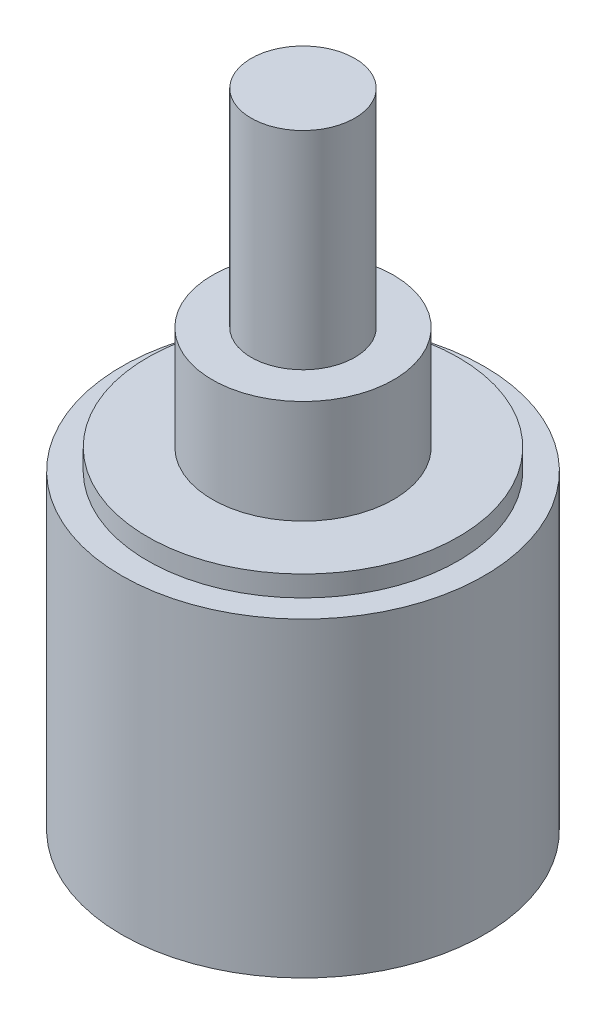
ISO-10303-21;
HEADER;
FILE_DESCRIPTION(('STEP AP214'),'2;1');
FILE_NAME('part.step','',(''),(''),'','','');
FILE_SCHEMA(('AUTOMOTIVE_DESIGN { 1 0 10303 214 1 1 1 1 }'));
ENDSEC;
DATA;
#1=APPLICATION_CONTEXT('core data for automotive mechanical design processes');
#2=APPLICATION_PROTOCOL_DEFINITION('international standard','automotive_design',2000,#1);
#3=PRODUCT_CONTEXT('',#1,'mechanical');
#4=PRODUCT('Part','Part','',(#3));
#5=PRODUCT_RELATED_PRODUCT_CATEGORY('part','',(#4));
#6=PRODUCT_DEFINITION_FORMATION('','',#4);
#7=PRODUCT_DEFINITION_CONTEXT('part definition',#1,'design');
#8=PRODUCT_DEFINITION('design','',#6,#7);
#9=PRODUCT_DEFINITION_SHAPE('','',#8);
#10=(LENGTH_UNIT() NAMED_UNIT(*) SI_UNIT(.MILLI.,.METRE.));
#11=(NAMED_UNIT(*) PLANE_ANGLE_UNIT() SI_UNIT($,.RADIAN.));
#12=(NAMED_UNIT(*) SI_UNIT($,.STERADIAN.) SOLID_ANGLE_UNIT());
#13=UNCERTAINTY_MEASURE_WITH_UNIT(LENGTH_MEASURE(1.E-05),#10,'distance_accuracy_value','');
#14=(GEOMETRIC_REPRESENTATION_CONTEXT(3) GLOBAL_UNCERTAINTY_ASSIGNED_CONTEXT((#13)) GLOBAL_UNIT_ASSIGNED_CONTEXT((#10,
#11,#12)) REPRESENTATION_CONTEXT('',''));
#15=CARTESIAN_POINT('',(0.,0.,0.));
#16=DIRECTION('',(0.,0.,1.));
#17=DIRECTION('',(1.,0.,0.));
#18=AXIS2_PLACEMENT_3D('',#15,#16,#17);
#19=CARTESIAN_POINT('',(0.,0.,0.));
#20=DIRECTION('',(0.,-1.,0.));
#21=DIRECTION('',(0.,0.,-1.));
#22=AXIS2_PLACEMENT_3D('',#19,#20,#21);
#23=CYLINDRICAL_SURFACE('',#22,11.1125);
#24=CARTESIAN_POINT('',(0.,19.05,0.));
#25=DIRECTION('',(0.,-1.,0.));
#26=DIRECTION('',(0.,0.,-1.));
#27=AXIS2_PLACEMENT_3D('',#24,#25,#26);
#28=CIRCLE('',#27,11.1125);
#29=CARTESIAN_POINT('',(0.,19.05,-11.1125));
#30=VERTEX_POINT('',#29);
#31=EDGE_CURVE('E10',#30,#30,#28,.T.);
#32=ORIENTED_EDGE('',*,*,#31,.T.);
#33=EDGE_LOOP('',(#32));
#34=FACE_BOUND('',#33,.T.);
#35=CARTESIAN_POINT('',(0.,0.,0.));
#36=DIRECTION('',(0.,-1.,0.));
#37=DIRECTION('',(0.,0.,-1.));
#38=AXIS2_PLACEMENT_3D('',#35,#36,#37);
#39=CIRCLE('',#38,11.1125);
#40=CARTESIAN_POINT('',(0.,0.,-11.1125));
#41=VERTEX_POINT('',#40);
#42=EDGE_CURVE('E61',#41,#41,#39,.T.);
#43=ORIENTED_EDGE('',*,*,#42,.F.);
#44=EDGE_LOOP('',(#43));
#45=FACE_BOUND('',#44,.T.);
#46=ADVANCED_FACE('F33',(#34,#45),#23,.T.);
#47=CARTESIAN_POINT('',(11.1125,19.05,0.));
#48=DIRECTION('',(0.,1.,0.));
#49=DIRECTION('',(0.,0.,1.));
#50=AXIS2_PLACEMENT_3D('',#47,#48,#49);
#51=PLANE('',#50);
#52=CARTESIAN_POINT('',(0.,19.05,0.));
#53=DIRECTION('',(0.,-1.,0.));
#54=DIRECTION('',(0.,0.,-1.));
#55=AXIS2_PLACEMENT_3D('',#52,#53,#54);
#56=CIRCLE('',#55,9.525);
#57=CARTESIAN_POINT('',(0.,19.05,-9.525));
#58=VERTEX_POINT('',#57);
#59=EDGE_CURVE('E39',#58,#58,#56,.T.);
#60=ORIENTED_EDGE('',*,*,#59,.T.);
#61=EDGE_LOOP('',(#60));
#62=FACE_BOUND('',#61,.T.);
#63=ORIENTED_EDGE('',*,*,#31,.F.);
#64=EDGE_LOOP('',(#63));
#65=FACE_BOUND('',#64,.T.);
#66=ADVANCED_FACE('F68',(#62,#65),#51,.T.);
#67=CARTESIAN_POINT('',(0.,0.,0.));
#68=DIRECTION('',(0.,-1.,0.));
#69=DIRECTION('',(0.,0.,-1.));
#70=AXIS2_PLACEMENT_3D('',#67,#68,#69);
#71=CYLINDRICAL_SURFACE('',#70,9.525);
#72=CARTESIAN_POINT('',(0.,20.32,0.));
#73=DIRECTION('',(0.,-1.,0.));
#74=DIRECTION('',(0.,0.,-1.));
#75=AXIS2_PLACEMENT_3D('',#72,#73,#74);
#76=CIRCLE('',#75,9.525);
#77=CARTESIAN_POINT('',(0.,20.32,-9.525));
#78=VERTEX_POINT('',#77);
#79=EDGE_CURVE('E43',#78,#78,#76,.T.);
#80=ORIENTED_EDGE('',*,*,#79,.T.);
#81=EDGE_LOOP('',(#80));
#82=FACE_BOUND('',#81,.T.);
#83=ORIENTED_EDGE('',*,*,#59,.F.);
#84=EDGE_LOOP('',(#83));
#85=FACE_BOUND('',#84,.T.);
#86=ADVANCED_FACE('F72',(#82,#85),#71,.T.);
#87=CARTESIAN_POINT('',(9.525,20.32,0.));
#88=DIRECTION('',(0.,1.,0.));
#89=DIRECTION('',(0.,0.,1.));
#90=AXIS2_PLACEMENT_3D('',#87,#88,#89);
#91=PLANE('',#90);
#92=CARTESIAN_POINT('',(0.,20.32,0.));
#93=DIRECTION('',(0.,-1.,0.));
#94=DIRECTION('',(0.,0.,-1.));
#95=AXIS2_PLACEMENT_3D('',#92,#93,#94);
#96=CIRCLE('',#95,5.55625);
#97=CARTESIAN_POINT('',(0.,20.32,-5.55625));
#98=VERTEX_POINT('',#97);
#99=EDGE_CURVE('E47',#98,#98,#96,.T.);
#100=ORIENTED_EDGE('',*,*,#99,.T.);
#101=EDGE_LOOP('',(#100));
#102=FACE_BOUND('',#101,.T.);
#103=ORIENTED_EDGE('',*,*,#79,.F.);
#104=EDGE_LOOP('',(#103));
#105=FACE_BOUND('',#104,.T.);
#106=ADVANCED_FACE('F76',(#102,#105),#91,.T.);
#107=CARTESIAN_POINT('',(0.,0.,0.));
#108=DIRECTION('',(0.,-1.,0.));
#109=DIRECTION('',(0.,0.,-1.));
#110=AXIS2_PLACEMENT_3D('',#107,#108,#109);
#111=CYLINDRICAL_SURFACE('',#110,5.55625);
#112=CARTESIAN_POINT('',(0.,26.67,0.));
#113=DIRECTION('',(0.,-1.,0.));
#114=DIRECTION('',(0.,0.,-1.));
#115=AXIS2_PLACEMENT_3D('',#112,#113,#114);
#116=CIRCLE('',#115,5.55625);
#117=CARTESIAN_POINT('',(0.,26.67,-5.55625));
#118=VERTEX_POINT('',#117);
#119=EDGE_CURVE('E52',#118,#118,#116,.T.);
#120=ORIENTED_EDGE('',*,*,#119,.T.);
#121=EDGE_LOOP('',(#120));
#122=FACE_BOUND('',#121,.T.);
#123=ORIENTED_EDGE('',*,*,#99,.F.);
#124=EDGE_LOOP('',(#123));
#125=FACE_BOUND('',#124,.T.);
#126=ADVANCED_FACE('F83',(#122,#125),#111,.T.);
#127=CARTESIAN_POINT('',(5.55625,26.67,0.));
#128=DIRECTION('',(0.,1.,0.));
#129=DIRECTION('',(0.,0.,1.));
#130=AXIS2_PLACEMENT_3D('',#127,#128,#129);
#131=PLANE('',#130);
#132=CARTESIAN_POINT('',(0.,26.67,0.));
#133=DIRECTION('',(0.,-1.,0.));
#134=DIRECTION('',(0.,0.,-1.));
#135=AXIS2_PLACEMENT_3D('',#132,#133,#134);
#136=CIRCLE('',#135,3.175);
#137=CARTESIAN_POINT('',(0.,26.67,-3.175));
#138=VERTEX_POINT('',#137);
#139=EDGE_CURVE('E55',#138,#138,#136,.T.);
#140=ORIENTED_EDGE('',*,*,#139,.T.);
#141=EDGE_LOOP('',(#140));
#142=FACE_BOUND('',#141,.T.);
#143=ORIENTED_EDGE('',*,*,#119,.F.);
#144=EDGE_LOOP('',(#143));
#145=FACE_BOUND('',#144,.T.);
#146=ADVANCED_FACE('F87',(#142,#145),#131,.T.);
#147=CARTESIAN_POINT('',(0.,0.,0.));
#148=DIRECTION('',(0.,-1.,0.));
#149=DIRECTION('',(0.,0.,-1.));
#150=AXIS2_PLACEMENT_3D('',#147,#148,#149);
#151=CYLINDRICAL_SURFACE('',#150,3.175);
#152=CARTESIAN_POINT('',(0.,39.37,0.));
#153=DIRECTION('',(0.,-1.,0.));
#154=DIRECTION('',(0.,0.,-1.));
#155=AXIS2_PLACEMENT_3D('',#152,#153,#154);
#156=CIRCLE('',#155,3.175);
#157=CARTESIAN_POINT('',(0.,39.37,-3.175));
#158=VERTEX_POINT('',#157);
#159=EDGE_CURVE('E58',#158,#158,#156,.T.);
#160=ORIENTED_EDGE('',*,*,#159,.T.);
#161=EDGE_LOOP('',(#160));
#162=FACE_BOUND('',#161,.T.);
#163=ORIENTED_EDGE('',*,*,#139,.F.);
#164=EDGE_LOOP('',(#163));
#165=FACE_BOUND('',#164,.T.);
#166=ADVANCED_FACE('F91',(#162,#165),#151,.T.);
#167=CARTESIAN_POINT('',(0.,39.37,0.));
#168=DIRECTION('',(0.,1.,0.));
#169=DIRECTION('',(0.,0.,1.));
#170=AXIS2_PLACEMENT_3D('',#167,#168,#169);
#171=PLANE('',#170);
#172=ORIENTED_EDGE('',*,*,#159,.F.);
#173=EDGE_LOOP('',(#172));
#174=FACE_BOUND('',#173,.T.);
#175=ADVANCED_FACE('F95',(#174),#171,.T.);
#176=CARTESIAN_POINT('',(0.,0.,0.));
#177=DIRECTION('',(0.,-1.,0.));
#178=DIRECTION('',(0.,0.,-1.));
#179=AXIS2_PLACEMENT_3D('',#176,#177,#178);
#180=PLANE('',#179);
#181=ORIENTED_EDGE('',*,*,#42,.T.);
#182=EDGE_LOOP('',(#181));
#183=FACE_BOUND('',#182,.T.);
#184=ADVANCED_FACE('F65',(#183),#180,.T.);
#185=CLOSED_SHELL('',(#46,#66,#86,#106,#126,#146,#166,#175,#184));
#186=MANIFOLD_SOLID_BREP('B2',#185);
#187=ADVANCED_BREP_SHAPE_REPRESENTATION('',(#18,#186),#14);
#188=SHAPE_DEFINITION_REPRESENTATION(#9,#187);
ENDSEC;
END-ISO-10303-21;
